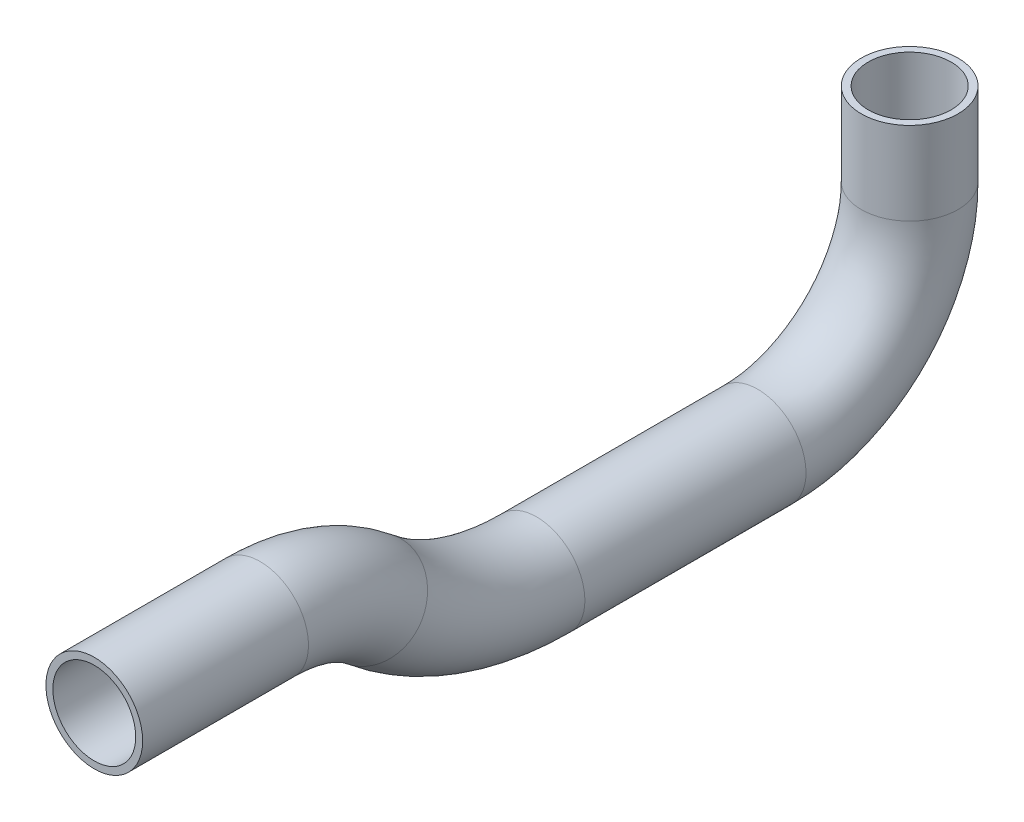
ISO-10303-21;
HEADER;
FILE_DESCRIPTION(('STEP AP214'),'2;1');
FILE_NAME('part.step','',(''),(''),'','','');
FILE_SCHEMA(('AUTOMOTIVE_DESIGN { 1 0 10303 214 1 1 1 1 }'));
ENDSEC;
DATA;
#1=APPLICATION_CONTEXT('core data for automotive mechanical design processes');
#2=APPLICATION_PROTOCOL_DEFINITION('international standard','automotive_design',2000,#1);
#3=PRODUCT_CONTEXT('',#1,'mechanical');
#4=PRODUCT('Part','Part','',(#3));
#5=PRODUCT_RELATED_PRODUCT_CATEGORY('part','',(#4));
#6=PRODUCT_DEFINITION_FORMATION('','',#4);
#7=PRODUCT_DEFINITION_CONTEXT('part definition',#1,'design');
#8=PRODUCT_DEFINITION('design','',#6,#7);
#9=PRODUCT_DEFINITION_SHAPE('','',#8);
#10=(LENGTH_UNIT() NAMED_UNIT(*) SI_UNIT(.MILLI.,.METRE.));
#11=(NAMED_UNIT(*) PLANE_ANGLE_UNIT() SI_UNIT($,.RADIAN.));
#12=(NAMED_UNIT(*) SI_UNIT($,.STERADIAN.) SOLID_ANGLE_UNIT());
#13=UNCERTAINTY_MEASURE_WITH_UNIT(LENGTH_MEASURE(1.E-05),#10,'distance_accuracy_value','');
#14=(GEOMETRIC_REPRESENTATION_CONTEXT(3) GLOBAL_UNCERTAINTY_ASSIGNED_CONTEXT((#13)) GLOBAL_UNIT_ASSIGNED_CONTEXT((#10,
#11,#12)) REPRESENTATION_CONTEXT('',''));
#15=CARTESIAN_POINT('',(0.,0.,0.));
#16=DIRECTION('',(0.,0.,1.));
#17=DIRECTION('',(1.,0.,0.));
#18=AXIS2_PLACEMENT_3D('',#15,#16,#17);
#19=CARTESIAN_POINT('',(0.,9.8,-59.));
#20=DIRECTION('',(0.,-1.,0.));
#21=DIRECTION('',(0.,0.,-1.));
#22=AXIS2_PLACEMENT_3D('',#19,#20,#21);
#23=CYLINDRICAL_SURFACE('',#22,3.5);
#24=CARTESIAN_POINT('',(0.,3.8,-59.));
#25=DIRECTION('',(0.,-1.,0.));
#26=DIRECTION('',(1.,0.,0.));
#27=AXIS2_PLACEMENT_3D('',#24,#25,#26);
#28=CIRCLE('',#27,3.5);
#29=CARTESIAN_POINT('',(0.,3.8,-62.5));
#30=VERTEX_POINT('',#29);
#31=EDGE_CURVE('E56',#30,#30,#28,.T.);
#32=ORIENTED_EDGE('',*,*,#31,.F.);
#33=EDGE_LOOP('',(#32));
#34=FACE_BOUND('',#33,.T.);
#35=CARTESIAN_POINT('',(0.,9.8,-59.));
#36=DIRECTION('',(0.,-1.,0.));
#37=DIRECTION('',(1.,0.,0.));
#38=AXIS2_PLACEMENT_3D('',#35,#36,#37);
#39=CIRCLE('',#38,3.5);
#40=CARTESIAN_POINT('',(3.5,9.8,-59.));
#41=VERTEX_POINT('',#40);
#42=EDGE_CURVE('E53',#41,#41,#39,.T.);
#43=ORIENTED_EDGE('',*,*,#42,.T.);
#44=EDGE_LOOP('',(#43));
#45=FACE_BOUND('',#44,.T.);
#46=ADVANCED_FACE('F32',(#34,#45),#23,.T.);
#47=CARTESIAN_POINT('',(0.,3.8,-48.));
#48=DIRECTION('',(-1.,0.,0.));
#49=DIRECTION('',(0.,0.,1.));
#50=AXIS2_PLACEMENT_3D('',#47,#48,#49);
#51=TOROIDAL_SURFACE('',#50,11.,3.5);
#52=CARTESIAN_POINT('',(0.,-7.2,-48.));
#53=DIRECTION('',(0.,0.,1.));
#54=DIRECTION('',(1.,0.,0.));
#55=AXIS2_PLACEMENT_3D('',#52,#53,#54);
#56=CIRCLE('',#55,3.5);
#57=CARTESIAN_POINT('',(0.,-10.7,-48.));
#58=VERTEX_POINT('',#57);
#59=EDGE_CURVE('E59',#58,#58,#56,.T.);
#60=CARTESIAN_POINT('',(0.,3.8,-48.));
#61=DIRECTION('',(-1.,0.,0.));
#62=DIRECTION('',(0.,0.,1.));
#63=AXIS2_PLACEMENT_3D('',#60,#61,#62);
#64=CIRCLE('',#63,14.5);
#65=EDGE_CURVE('',#30,#58,#64,.T.);
#66=ORIENTED_EDGE('',*,*,#31,.T.);
#67=ORIENTED_EDGE('',*,*,#59,.F.);
#68=ORIENTED_EDGE('',*,*,#65,.T.);
#69=ORIENTED_EDGE('',*,*,#65,.F.);
#70=EDGE_LOOP('',(#66,#68,#67,#69));
#71=FACE_BOUND('',#70,.T.);
#72=ADVANCED_FACE('F107',(#71),#51,.T.);
#73=CARTESIAN_POINT('',(0.,-7.2,-48.));
#74=DIRECTION('',(0.,0.,1.));
#75=DIRECTION('',(0.,-1.,0.));
#76=AXIS2_PLACEMENT_3D('',#73,#74,#75);
#77=CYLINDRICAL_SURFACE('',#76,3.5);
#78=CARTESIAN_POINT('',(0.,-7.2,-32.));
#79=DIRECTION('',(0.,0.,1.));
#80=DIRECTION('',(1.,0.,0.));
#81=AXIS2_PLACEMENT_3D('',#78,#79,#80);
#82=CIRCLE('',#81,3.5);
#83=CARTESIAN_POINT('',(0.,-10.7,-32.));
#84=VERTEX_POINT('',#83);
#85=EDGE_CURVE('E62',#84,#84,#82,.T.);
#86=ORIENTED_EDGE('',*,*,#85,.F.);
#87=EDGE_LOOP('',(#86));
#88=FACE_BOUND('',#87,.T.);
#89=ORIENTED_EDGE('',*,*,#59,.T.);
#90=EDGE_LOOP('',(#89));
#91=FACE_BOUND('',#90,.T.);
#92=ADVANCED_FACE('F81',(#88,#91),#77,.T.);
#93=CARTESIAN_POINT('',(0.,11.6777777777778,-32.));
#94=DIRECTION('',(-1.,0.,0.));
#95=DIRECTION('',(0.,0.,1.));
#96=AXIS2_PLACEMENT_3D('',#93,#94,#95);
#97=TOROIDAL_SURFACE('',#96,18.8777777777778,3.5);
#98=CARTESIAN_POINT('',(0.,-2.86827195467423,-19.9674220963173));
#99=DIRECTION('',(0.,0.637393767705382,0.770538243626062));
#100=DIRECTION('',(1.,0.,0.));
#101=AXIS2_PLACEMENT_3D('',#98,#99,#100);
#102=CIRCLE('',#101,3.5);
#103=CARTESIAN_POINT('',(0.,-5.56515580736544,-17.7365439093485));
#104=VERTEX_POINT('',#103);
#105=EDGE_CURVE('E64',#104,#104,#102,.T.);
#106=CARTESIAN_POINT('',(0.,11.6777777777778,-32.));
#107=DIRECTION('',(-1.,0.,0.));
#108=DIRECTION('',(0.,0.,1.));
#109=AXIS2_PLACEMENT_3D('',#106,#107,#108);
#110=CIRCLE('',#109,22.3777777777778);
#111=EDGE_CURVE('',#84,#104,#110,.T.);
#112=ORIENTED_EDGE('',*,*,#85,.T.);
#113=ORIENTED_EDGE('',*,*,#105,.F.);
#114=ORIENTED_EDGE('',*,*,#111,.T.);
#115=ORIENTED_EDGE('',*,*,#111,.F.);
#116=EDGE_LOOP('',(#112,#114,#113,#115));
#117=FACE_BOUND('',#116,.T.);
#118=ADVANCED_FACE('F74',(#117),#97,.T.);
#119=CARTESIAN_POINT('',(0.,-12.5,-12.));
#120=DIRECTION('',(1.,0.,0.));
#121=DIRECTION('',(0.,0.,-1.));
#122=AXIS2_PLACEMENT_3D('',#119,#120,#121);
#123=TOROIDAL_SURFACE('',#122,12.5,3.5);
#124=CARTESIAN_POINT('',(0.,0.,-12.));
#125=DIRECTION('',(0.,0.,1.));
#126=DIRECTION('',(1.,0.,0.));
#127=AXIS2_PLACEMENT_3D('',#124,#125,#126);
#128=CIRCLE('',#127,3.5);
#129=CARTESIAN_POINT('',(3.5,0.,-12.));
#130=VERTEX_POINT('',#129);
#131=EDGE_CURVE('E36',#130,#130,#128,.T.);
#132=ORIENTED_EDGE('',*,*,#131,.F.);
#133=EDGE_LOOP('',(#132));
#134=FACE_BOUND('',#133,.T.);
#135=ORIENTED_EDGE('',*,*,#105,.T.);
#136=EDGE_LOOP('',(#135));
#137=FACE_BOUND('',#136,.T.);
#138=ADVANCED_FACE('F72',(#134,#137),#123,.T.);
#139=CARTESIAN_POINT('',(0.,0.,-12.));
#140=DIRECTION('',(0.,0.,1.));
#141=DIRECTION('',(1.,0.,0.));
#142=AXIS2_PLACEMENT_3D('',#139,#140,#141);
#143=CYLINDRICAL_SURFACE('',#142,3.5);
#144=CARTESIAN_POINT('',(0.,0.,0.));
#145=DIRECTION('',(0.,0.,1.));
#146=DIRECTION('',(1.,0.,0.));
#147=AXIS2_PLACEMENT_3D('',#144,#145,#146);
#148=CIRCLE('',#147,3.5);
#149=CARTESIAN_POINT('',(3.5,0.,0.));
#150=VERTEX_POINT('',#149);
#151=EDGE_CURVE('E49',#150,#150,#148,.T.);
#152=ORIENTED_EDGE('',*,*,#151,.F.);
#153=EDGE_LOOP('',(#152));
#154=FACE_BOUND('',#153,.T.);
#155=ORIENTED_EDGE('',*,*,#131,.T.);
#156=EDGE_LOOP('',(#155));
#157=FACE_BOUND('',#156,.T.);
#158=ADVANCED_FACE('F34',(#154,#157),#143,.T.);
#159=CARTESIAN_POINT('',(0.,9.8,-59.));
#160=DIRECTION('',(0.,-1.,0.));
#161=DIRECTION('',(1.,0.,0.));
#162=AXIS2_PLACEMENT_3D('',#159,#160,#161);
#163=PLANE('',#162);
#164=CARTESIAN_POINT('',(0.,9.8,-59.));
#165=DIRECTION('',(0.,-1.,0.));
#166=DIRECTION('',(1.,0.,0.));
#167=AXIS2_PLACEMENT_3D('',#164,#165,#166);
#168=CIRCLE('',#167,3.);
#169=CARTESIAN_POINT('',(3.,9.8,-59.));
#170=VERTEX_POINT('',#169);
#171=EDGE_CURVE('E52',#170,#170,#168,.F.);
#172=ORIENTED_EDGE('',*,*,#171,.F.);
#173=EDGE_LOOP('',(#172));
#174=FACE_BOUND('',#173,.T.);
#175=ORIENTED_EDGE('',*,*,#42,.F.);
#176=EDGE_LOOP('',(#175));
#177=FACE_BOUND('',#176,.T.);
#178=ADVANCED_FACE('F79',(#174,#177),#163,.F.);
#179=CARTESIAN_POINT('',(0.,0.,0.));
#180=DIRECTION('',(0.,0.,1.));
#181=DIRECTION('',(1.,0.,0.));
#182=AXIS2_PLACEMENT_3D('',#179,#180,#181);
#183=PLANE('',#182);
#184=CARTESIAN_POINT('',(0.,0.,0.));
#185=DIRECTION('',(0.,0.,1.));
#186=DIRECTION('',(1.,0.,0.));
#187=AXIS2_PLACEMENT_3D('',#184,#185,#186);
#188=CIRCLE('',#187,3.);
#189=CARTESIAN_POINT('',(3.,0.,0.));
#190=VERTEX_POINT('',#189);
#191=EDGE_CURVE('E10',#190,#190,#188,.F.);
#192=ORIENTED_EDGE('',*,*,#191,.T.);
#193=EDGE_LOOP('',(#192));
#194=FACE_BOUND('',#193,.T.);
#195=ORIENTED_EDGE('',*,*,#151,.T.);
#196=EDGE_LOOP('',(#195));
#197=FACE_BOUND('',#196,.T.);
#198=ADVANCED_FACE('F98',(#194,#197),#183,.T.);
#199=CARTESIAN_POINT('',(0.,9.8,-59.));
#200=DIRECTION('',(0.,-1.,0.));
#201=DIRECTION('',(0.,0.,-1.));
#202=AXIS2_PLACEMENT_3D('',#199,#200,#201);
#203=CYLINDRICAL_SURFACE('',#202,3.);
#204=CARTESIAN_POINT('',(0.,3.8,-59.));
#205=DIRECTION('',(0.,-1.,0.));
#206=DIRECTION('',(1.,0.,0.));
#207=AXIS2_PLACEMENT_3D('',#204,#205,#206);
#208=CIRCLE('',#207,3.);
#209=CARTESIAN_POINT('',(0.,3.8,-62.));
#210=VERTEX_POINT('',#209);
#211=EDGE_CURVE('E213',#210,#210,#208,.F.);
#212=ORIENTED_EDGE('',*,*,#211,.F.);
#213=EDGE_LOOP('',(#212));
#214=FACE_BOUND('',#213,.T.);
#215=ORIENTED_EDGE('',*,*,#171,.T.);
#216=EDGE_LOOP('',(#215));
#217=FACE_BOUND('',#216,.T.);
#218=ADVANCED_FACE('F101',(#214,#217),#203,.F.);
#219=CARTESIAN_POINT('',(0.,3.8,-48.));
#220=DIRECTION('',(-1.,0.,0.));
#221=DIRECTION('',(0.,0.,1.));
#222=AXIS2_PLACEMENT_3D('',#219,#220,#221);
#223=TOROIDAL_SURFACE('',#222,11.,3.);
#224=CARTESIAN_POINT('',(0.,-7.2,-48.));
#225=DIRECTION('',(0.,0.,1.));
#226=DIRECTION('',(1.,0.,0.));
#227=AXIS2_PLACEMENT_3D('',#224,#225,#226);
#228=CIRCLE('',#227,3.);
#229=CARTESIAN_POINT('',(0.,-10.2,-48.));
#230=VERTEX_POINT('',#229);
#231=EDGE_CURVE('E210',#230,#230,#228,.F.);
#232=CARTESIAN_POINT('',(0.,3.8,-48.));
#233=DIRECTION('',(-1.,0.,0.));
#234=DIRECTION('',(0.,0.,1.));
#235=AXIS2_PLACEMENT_3D('',#232,#233,#234);
#236=CIRCLE('',#235,14.);
#237=EDGE_CURVE('',#210,#230,#236,.T.);
#238=ORIENTED_EDGE('',*,*,#211,.T.);
#239=ORIENTED_EDGE('',*,*,#231,.F.);
#240=ORIENTED_EDGE('',*,*,#237,.T.);
#241=ORIENTED_EDGE('',*,*,#237,.F.);
#242=EDGE_LOOP('',(#238,#240,#239,#241));
#243=FACE_BOUND('',#242,.T.);
#244=ADVANCED_FACE('F162',(#243),#223,.F.);
#245=CARTESIAN_POINT('',(0.,-7.2,-48.));
#246=DIRECTION('',(0.,0.,1.));
#247=DIRECTION('',(0.,-1.,0.));
#248=AXIS2_PLACEMENT_3D('',#245,#246,#247);
#249=CYLINDRICAL_SURFACE('',#248,3.);
#250=CARTESIAN_POINT('',(0.,-7.2,-32.));
#251=DIRECTION('',(0.,0.,1.));
#252=DIRECTION('',(1.,0.,0.));
#253=AXIS2_PLACEMENT_3D('',#250,#251,#252);
#254=CIRCLE('',#253,3.);
#255=CARTESIAN_POINT('',(0.,-10.2,-32.));
#256=VERTEX_POINT('',#255);
#257=EDGE_CURVE('E209',#256,#256,#254,.F.);
#258=ORIENTED_EDGE('',*,*,#257,.F.);
#259=EDGE_LOOP('',(#258));
#260=FACE_BOUND('',#259,.T.);
#261=ORIENTED_EDGE('',*,*,#231,.T.);
#262=EDGE_LOOP('',(#261));
#263=FACE_BOUND('',#262,.T.);
#264=ADVANCED_FACE('F172',(#260,#263),#249,.F.);
#265=CARTESIAN_POINT('',(0.,11.6777777777778,-32.));
#266=DIRECTION('',(-1.,0.,0.));
#267=DIRECTION('',(0.,0.,1.));
#268=AXIS2_PLACEMENT_3D('',#265,#266,#267);
#269=TOROIDAL_SURFACE('',#268,18.8777777777778,3.);
#270=CARTESIAN_POINT('',(0.,-2.86827195467423,-19.9674220963173));
#271=DIRECTION('',(0.,0.637393767705382,0.770538243626062));
#272=DIRECTION('',(1.,0.,0.));
#273=AXIS2_PLACEMENT_3D('',#270,#271,#272);
#274=CIRCLE('',#273,3.);
#275=CARTESIAN_POINT('',(0.,-5.17988668555241,-18.0552407932011));
#276=VERTEX_POINT('',#275);
#277=EDGE_CURVE('E45',#276,#276,#274,.F.);
#278=CARTESIAN_POINT('',(0.,11.6777777777778,-32.));
#279=DIRECTION('',(-1.,0.,0.));
#280=DIRECTION('',(0.,0.,1.));
#281=AXIS2_PLACEMENT_3D('',#278,#279,#280);
#282=CIRCLE('',#281,21.8777777777778);
#283=EDGE_CURVE('',#256,#276,#282,.T.);
#284=ORIENTED_EDGE('',*,*,#257,.T.);
#285=ORIENTED_EDGE('',*,*,#277,.F.);
#286=ORIENTED_EDGE('',*,*,#283,.T.);
#287=ORIENTED_EDGE('',*,*,#283,.F.);
#288=EDGE_LOOP('',(#284,#286,#285,#287));
#289=FACE_BOUND('',#288,.T.);
#290=ADVANCED_FACE('F92',(#289),#269,.F.);
#291=CARTESIAN_POINT('',(0.,-12.5,-12.));
#292=DIRECTION('',(1.,0.,0.));
#293=DIRECTION('',(0.,0.,-1.));
#294=AXIS2_PLACEMENT_3D('',#291,#292,#293);
#295=TOROIDAL_SURFACE('',#294,12.5,3.);
#296=CARTESIAN_POINT('',(0.,0.,-12.));
#297=DIRECTION('',(0.,0.,1.));
#298=DIRECTION('',(1.,0.,0.));
#299=AXIS2_PLACEMENT_3D('',#296,#297,#298);
#300=CIRCLE('',#299,3.);
#301=CARTESIAN_POINT('',(3.,0.,-12.));
#302=VERTEX_POINT('',#301);
#303=EDGE_CURVE('E40',#302,#302,#300,.F.);
#304=ORIENTED_EDGE('',*,*,#303,.F.);
#305=EDGE_LOOP('',(#304));
#306=FACE_BOUND('',#305,.T.);
#307=ORIENTED_EDGE('',*,*,#277,.T.);
#308=EDGE_LOOP('',(#307));
#309=FACE_BOUND('',#308,.T.);
#310=ADVANCED_FACE('F86',(#306,#309),#295,.F.);
#311=CARTESIAN_POINT('',(0.,0.,-12.));
#312=DIRECTION('',(0.,0.,1.));
#313=DIRECTION('',(1.,0.,0.));
#314=AXIS2_PLACEMENT_3D('',#311,#312,#313);
#315=CYLINDRICAL_SURFACE('',#314,3.);
#316=ORIENTED_EDGE('',*,*,#191,.F.);
#317=EDGE_LOOP('',(#316));
#318=FACE_BOUND('',#317,.T.);
#319=ORIENTED_EDGE('',*,*,#303,.T.);
#320=EDGE_LOOP('',(#319));
#321=FACE_BOUND('',#320,.T.);
#322=ADVANCED_FACE('F84',(#318,#321),#315,.F.);
#323=CLOSED_SHELL('',(#46,#72,#92,#118,#138,#158,#178,#198,#218,#244,#264,#290,#310,#322));
#324=MANIFOLD_SOLID_BREP('B2',#323);
#325=ADVANCED_BREP_SHAPE_REPRESENTATION('',(#18,#324),#14);
#326=SHAPE_DEFINITION_REPRESENTATION(#9,#325);
ENDSEC;
END-ISO-10303-21;
